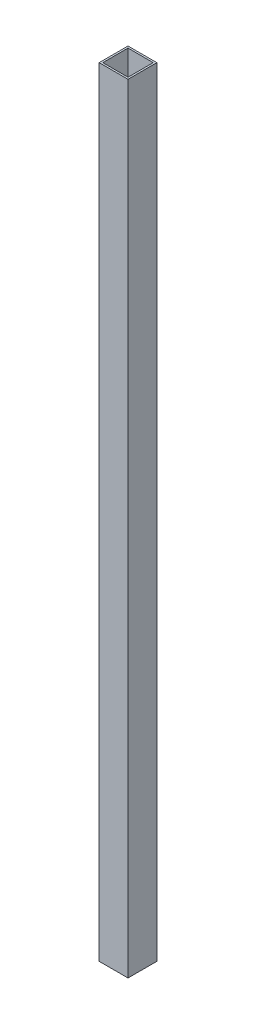
ISO-10303-21;
HEADER;
FILE_DESCRIPTION(('STEP AP214'),'2;1');
FILE_NAME('part.step','',(''),(''),'','','');
FILE_SCHEMA(('AUTOMOTIVE_DESIGN { 1 0 10303 214 1 1 1 1 }'));
ENDSEC;
DATA;
#1=APPLICATION_CONTEXT('core data for automotive mechanical design processes');
#2=APPLICATION_PROTOCOL_DEFINITION('international standard','automotive_design',2000,#1);
#3=PRODUCT_CONTEXT('',#1,'mechanical');
#4=PRODUCT('Part','Part','',(#3));
#5=PRODUCT_RELATED_PRODUCT_CATEGORY('part','',(#4));
#6=PRODUCT_DEFINITION_FORMATION('','',#4);
#7=PRODUCT_DEFINITION_CONTEXT('part definition',#1,'design');
#8=PRODUCT_DEFINITION('design','',#6,#7);
#9=PRODUCT_DEFINITION_SHAPE('','',#8);
#10=(LENGTH_UNIT() NAMED_UNIT(*) SI_UNIT(.MILLI.,.METRE.));
#11=(NAMED_UNIT(*) PLANE_ANGLE_UNIT() SI_UNIT($,.RADIAN.));
#12=(NAMED_UNIT(*) SI_UNIT($,.STERADIAN.) SOLID_ANGLE_UNIT());
#13=UNCERTAINTY_MEASURE_WITH_UNIT(LENGTH_MEASURE(1.E-05),#10,'distance_accuracy_value','');
#14=(GEOMETRIC_REPRESENTATION_CONTEXT(3) GLOBAL_UNCERTAINTY_ASSIGNED_CONTEXT((#13)) GLOBAL_UNIT_ASSIGNED_CONTEXT((#10,
#11,#12)) REPRESENTATION_CONTEXT('',''));
#15=CARTESIAN_POINT('',(0.,0.,0.));
#16=DIRECTION('',(0.,0.,1.));
#17=DIRECTION('',(1.,0.,0.));
#18=AXIS2_PLACEMENT_3D('',#15,#16,#17);
#19=CARTESIAN_POINT('',(0.,685.8,0.));
#20=DIRECTION('',(0.,-1.,0.));
#21=DIRECTION('',(0.,0.,-1.));
#22=AXIS2_PLACEMENT_3D('',#19,#20,#21);
#23=PLANE('',#22);
#24=DIRECTION('',(0.,0.,-1.));
#25=VECTOR('',#24,1.);
#26=CARTESIAN_POINT('',(12.7,685.8,12.7));
#27=LINE('',#26,#25);
#28=CARTESIAN_POINT('',(12.7,685.8,12.7));
#29=VERTEX_POINT('',#28);
#30=CARTESIAN_POINT('',(12.7,685.8,-12.7));
#31=VERTEX_POINT('',#30);
#32=EDGE_CURVE('E133',#29,#31,#27,.T.);
#33=ORIENTED_EDGE('',*,*,#32,.T.);
#34=DIRECTION('',(-1.,0.,0.));
#35=VECTOR('',#34,1.);
#36=CARTESIAN_POINT('',(-12.7,685.8,-12.7));
#37=LINE('',#36,#35);
#38=CARTESIAN_POINT('',(-12.7,685.8,-12.7));
#39=VERTEX_POINT('',#38);
#40=EDGE_CURVE('E136',#31,#39,#37,.T.);
#41=ORIENTED_EDGE('',*,*,#40,.T.);
#42=DIRECTION('',(0.,0.,1.));
#43=VECTOR('',#42,1.);
#44=CARTESIAN_POINT('',(-12.7,685.8,12.7));
#45=LINE('',#44,#43);
#46=CARTESIAN_POINT('',(-12.7,685.8,12.7));
#47=VERTEX_POINT('',#46);
#48=EDGE_CURVE('E139',#39,#47,#45,.T.);
#49=ORIENTED_EDGE('',*,*,#48,.T.);
#50=DIRECTION('',(1.,0.,0.));
#51=VECTOR('',#50,1.);
#52=CARTESIAN_POINT('',(-12.7,685.8,12.7));
#53=LINE('',#52,#51);
#54=EDGE_CURVE('E141',#47,#29,#53,.T.);
#55=ORIENTED_EDGE('',*,*,#54,.T.);
#56=EDGE_LOOP('',(#33,#41,#49,#55));
#57=FACE_BOUND('',#56,.T.);
#58=DIRECTION('',(0.,0.,-1.));
#59=VECTOR('',#58,1.);
#60=CARTESIAN_POINT('',(11.1125,685.8,11.1125));
#61=LINE('',#60,#59);
#62=CARTESIAN_POINT('',(11.1125,685.8,11.1125));
#63=VERTEX_POINT('',#62);
#64=CARTESIAN_POINT('',(11.1125,685.8,-11.1125));
#65=VERTEX_POINT('',#64);
#66=EDGE_CURVE('E97',#63,#65,#61,.T.);
#67=ORIENTED_EDGE('',*,*,#66,.F.);
#68=DIRECTION('',(1.,0.,0.));
#69=VECTOR('',#68,1.);
#70=CARTESIAN_POINT('',(-11.1125,685.8,11.1125));
#71=LINE('',#70,#69);
#72=CARTESIAN_POINT('',(-11.1125,685.8,11.1125));
#73=VERTEX_POINT('',#72);
#74=EDGE_CURVE('E119',#73,#63,#71,.T.);
#75=ORIENTED_EDGE('',*,*,#74,.F.);
#76=DIRECTION('',(0.,0.,1.));
#77=VECTOR('',#76,1.);
#78=CARTESIAN_POINT('',(-11.1125,685.8,11.1125));
#79=LINE('',#78,#77);
#80=CARTESIAN_POINT('',(-11.1125,685.8,-11.1125));
#81=VERTEX_POINT('',#80);
#82=EDGE_CURVE('E117',#81,#73,#79,.T.);
#83=ORIENTED_EDGE('',*,*,#82,.F.);
#84=DIRECTION('',(-1.,0.,0.));
#85=VECTOR('',#84,1.);
#86=CARTESIAN_POINT('',(-11.1125,685.8,-11.1125));
#87=LINE('',#86,#85);
#88=EDGE_CURVE('E105',#65,#81,#87,.T.);
#89=ORIENTED_EDGE('',*,*,#88,.F.);
#90=EDGE_LOOP('',(#67,#75,#83,#89));
#91=FACE_BOUND('',#90,.T.);
#92=ADVANCED_FACE('F32',(#57,#91),#23,.F.);
#93=CARTESIAN_POINT('',(0.,0.,0.));
#94=DIRECTION('',(0.,-1.,0.));
#95=DIRECTION('',(0.,0.,-1.));
#96=AXIS2_PLACEMENT_3D('',#93,#94,#95);
#97=PLANE('',#96);
#98=DIRECTION('',(0.,0.,-1.));
#99=VECTOR('',#98,1.);
#100=CARTESIAN_POINT('',(12.7,0.,12.7));
#101=LINE('',#100,#99);
#102=CARTESIAN_POINT('',(12.7,0.,12.7));
#103=VERTEX_POINT('',#102);
#104=CARTESIAN_POINT('',(12.7,0.,-12.7));
#105=VERTEX_POINT('',#104);
#106=EDGE_CURVE('E113',#103,#105,#101,.T.);
#107=ORIENTED_EDGE('',*,*,#106,.F.);
#108=DIRECTION('',(1.,0.,0.));
#109=VECTOR('',#108,1.);
#110=CARTESIAN_POINT('',(-12.7,0.,12.7));
#111=LINE('',#110,#109);
#112=CARTESIAN_POINT('',(-12.7,0.,12.7));
#113=VERTEX_POINT('',#112);
#114=EDGE_CURVE('E137',#113,#103,#111,.T.);
#115=ORIENTED_EDGE('',*,*,#114,.F.);
#116=DIRECTION('',(0.,0.,1.));
#117=VECTOR('',#116,1.);
#118=CARTESIAN_POINT('',(-12.7,0.,12.7));
#119=LINE('',#118,#117);
#120=CARTESIAN_POINT('',(-12.7,0.,-12.7));
#121=VERTEX_POINT('',#120);
#122=EDGE_CURVE('E148',#121,#113,#119,.T.);
#123=ORIENTED_EDGE('',*,*,#122,.F.);
#124=DIRECTION('',(-1.,0.,0.));
#125=VECTOR('',#124,1.);
#126=CARTESIAN_POINT('',(-12.7,0.,-12.7));
#127=LINE('',#126,#125);
#128=EDGE_CURVE('E146',#105,#121,#127,.T.);
#129=ORIENTED_EDGE('',*,*,#128,.F.);
#130=EDGE_LOOP('',(#107,#115,#123,#129));
#131=FACE_BOUND('',#130,.T.);
#132=DIRECTION('',(1.,0.,0.));
#133=VECTOR('',#132,1.);
#134=CARTESIAN_POINT('',(-11.1125,0.,11.1125));
#135=LINE('',#134,#133);
#136=CARTESIAN_POINT('',(-11.1125,0.,11.1125));
#137=VERTEX_POINT('',#136);
#138=CARTESIAN_POINT('',(11.1125,0.,11.1125));
#139=VERTEX_POINT('',#138);
#140=EDGE_CURVE('E106',#137,#139,#135,.T.);
#141=ORIENTED_EDGE('',*,*,#140,.T.);
#142=DIRECTION('',(0.,0.,-1.));
#143=VECTOR('',#142,1.);
#144=CARTESIAN_POINT('',(11.1125,0.,11.1125));
#145=LINE('',#144,#143);
#146=CARTESIAN_POINT('',(11.1125,0.,-11.1125));
#147=VERTEX_POINT('',#146);
#148=EDGE_CURVE('E55',#139,#147,#145,.T.);
#149=ORIENTED_EDGE('',*,*,#148,.T.);
#150=DIRECTION('',(-1.,0.,0.));
#151=VECTOR('',#150,1.);
#152=CARTESIAN_POINT('',(-11.1125,0.,-11.1125));
#153=LINE('',#152,#151);
#154=CARTESIAN_POINT('',(-11.1125,0.,-11.1125));
#155=VERTEX_POINT('',#154);
#156=EDGE_CURVE('E112',#147,#155,#153,.T.);
#157=ORIENTED_EDGE('',*,*,#156,.T.);
#158=DIRECTION('',(0.,0.,1.));
#159=VECTOR('',#158,1.);
#160=CARTESIAN_POINT('',(-11.1125,0.,11.1125));
#161=LINE('',#160,#159);
#162=EDGE_CURVE('E125',#155,#137,#161,.T.);
#163=ORIENTED_EDGE('',*,*,#162,.T.);
#164=EDGE_LOOP('',(#141,#149,#157,#163));
#165=FACE_BOUND('',#164,.T.);
#166=ADVANCED_FACE('F166',(#131,#165),#97,.T.);
#167=CARTESIAN_POINT('',(12.7,685.8,12.7));
#168=DIRECTION('',(-1.,0.,0.));
#169=DIRECTION('',(0.,0.,1.));
#170=AXIS2_PLACEMENT_3D('',#167,#168,#169);
#171=PLANE('',#170);
#172=ORIENTED_EDGE('',*,*,#106,.T.);
#173=DIRECTION('',(0.,-1.,0.));
#174=VECTOR('',#173,1.);
#175=CARTESIAN_POINT('',(12.7,685.8,-12.7));
#176=LINE('',#175,#174);
#177=EDGE_CURVE('E11',#31,#105,#176,.T.);
#178=ORIENTED_EDGE('',*,*,#177,.F.);
#179=ORIENTED_EDGE('',*,*,#32,.F.);
#180=DIRECTION('',(0.,-1.,0.));
#181=VECTOR('',#180,1.);
#182=CARTESIAN_POINT('',(12.7,685.8,12.7));
#183=LINE('',#182,#181);
#184=EDGE_CURVE('E143',#29,#103,#183,.T.);
#185=ORIENTED_EDGE('',*,*,#184,.T.);
#186=EDGE_LOOP('',(#172,#178,#179,#185));
#187=FACE_BOUND('',#186,.T.);
#188=ADVANCED_FACE('F34',(#187),#171,.F.);
#189=CARTESIAN_POINT('',(-12.7,685.8,-12.7));
#190=DIRECTION('',(0.,0.,1.));
#191=DIRECTION('',(1.,0.,0.));
#192=AXIS2_PLACEMENT_3D('',#189,#190,#191);
#193=PLANE('',#192);
#194=ORIENTED_EDGE('',*,*,#128,.T.);
#195=DIRECTION('',(0.,-1.,0.));
#196=VECTOR('',#195,1.);
#197=CARTESIAN_POINT('',(-12.7,685.8,-12.7));
#198=LINE('',#197,#196);
#199=EDGE_CURVE('E40',#39,#121,#198,.T.);
#200=ORIENTED_EDGE('',*,*,#199,.F.);
#201=ORIENTED_EDGE('',*,*,#40,.F.);
#202=ORIENTED_EDGE('',*,*,#177,.T.);
#203=EDGE_LOOP('',(#194,#200,#201,#202));
#204=FACE_BOUND('',#203,.T.);
#205=ADVANCED_FACE('F176',(#204),#193,.F.);
#206=CARTESIAN_POINT('',(-12.7,685.8,12.7));
#207=DIRECTION('',(1.,0.,0.));
#208=DIRECTION('',(0.,0.,-1.));
#209=AXIS2_PLACEMENT_3D('',#206,#207,#208);
#210=PLANE('',#209);
#211=ORIENTED_EDGE('',*,*,#122,.T.);
#212=DIRECTION('',(0.,-1.,0.));
#213=VECTOR('',#212,1.);
#214=CARTESIAN_POINT('',(-12.7,685.8,12.7));
#215=LINE('',#214,#213);
#216=EDGE_CURVE('E153',#47,#113,#215,.T.);
#217=ORIENTED_EDGE('',*,*,#216,.F.);
#218=ORIENTED_EDGE('',*,*,#48,.F.);
#219=ORIENTED_EDGE('',*,*,#199,.T.);
#220=EDGE_LOOP('',(#211,#217,#218,#219));
#221=FACE_BOUND('',#220,.T.);
#222=ADVANCED_FACE('F160',(#221),#210,.F.);
#223=CARTESIAN_POINT('',(-12.7,685.8,12.7));
#224=DIRECTION('',(0.,0.,-1.));
#225=DIRECTION('',(-1.,0.,0.));
#226=AXIS2_PLACEMENT_3D('',#223,#224,#225);
#227=PLANE('',#226);
#228=ORIENTED_EDGE('',*,*,#114,.T.);
#229=ORIENTED_EDGE('',*,*,#184,.F.);
#230=ORIENTED_EDGE('',*,*,#54,.F.);
#231=ORIENTED_EDGE('',*,*,#216,.T.);
#232=EDGE_LOOP('',(#228,#229,#230,#231));
#233=FACE_BOUND('',#232,.T.);
#234=ADVANCED_FACE('F170',(#233),#227,.F.);
#235=CARTESIAN_POINT('',(11.1125,685.8,11.1125));
#236=DIRECTION('',(-1.,0.,0.));
#237=DIRECTION('',(0.,0.,1.));
#238=AXIS2_PLACEMENT_3D('',#235,#236,#237);
#239=PLANE('',#238);
#240=ORIENTED_EDGE('',*,*,#148,.F.);
#241=DIRECTION('',(0.,-1.,0.));
#242=VECTOR('',#241,1.);
#243=CARTESIAN_POINT('',(11.1125,685.8,11.1125));
#244=LINE('',#243,#242);
#245=EDGE_CURVE('E101',#63,#139,#244,.T.);
#246=ORIENTED_EDGE('',*,*,#245,.F.);
#247=ORIENTED_EDGE('',*,*,#66,.T.);
#248=DIRECTION('',(0.,-1.,0.));
#249=VECTOR('',#248,1.);
#250=CARTESIAN_POINT('',(11.1125,685.8,-11.1125));
#251=LINE('',#250,#249);
#252=EDGE_CURVE('E100',#65,#147,#251,.T.);
#253=ORIENTED_EDGE('',*,*,#252,.T.);
#254=EDGE_LOOP('',(#240,#246,#247,#253));
#255=FACE_BOUND('',#254,.T.);
#256=ADVANCED_FACE('F99',(#255),#239,.T.);
#257=CARTESIAN_POINT('',(-11.1125,685.8,-11.1125));
#258=DIRECTION('',(0.,0.,1.));
#259=DIRECTION('',(1.,0.,0.));
#260=AXIS2_PLACEMENT_3D('',#257,#258,#259);
#261=PLANE('',#260);
#262=ORIENTED_EDGE('',*,*,#156,.F.);
#263=ORIENTED_EDGE('',*,*,#252,.F.);
#264=ORIENTED_EDGE('',*,*,#88,.T.);
#265=DIRECTION('',(0.,-1.,0.));
#266=VECTOR('',#265,1.);
#267=CARTESIAN_POINT('',(-11.1125,685.8,-11.1125));
#268=LINE('',#267,#266);
#269=EDGE_CURVE('E114',#81,#155,#268,.T.);
#270=ORIENTED_EDGE('',*,*,#269,.T.);
#271=EDGE_LOOP('',(#262,#263,#264,#270));
#272=FACE_BOUND('',#271,.T.);
#273=ADVANCED_FACE('F109',(#272),#261,.T.);
#274=CARTESIAN_POINT('',(-11.1125,685.8,11.1125));
#275=DIRECTION('',(1.,0.,0.));
#276=DIRECTION('',(0.,0.,-1.));
#277=AXIS2_PLACEMENT_3D('',#274,#275,#276);
#278=PLANE('',#277);
#279=ORIENTED_EDGE('',*,*,#162,.F.);
#280=ORIENTED_EDGE('',*,*,#269,.F.);
#281=ORIENTED_EDGE('',*,*,#82,.T.);
#282=DIRECTION('',(0.,-1.,0.));
#283=VECTOR('',#282,1.);
#284=CARTESIAN_POINT('',(-11.1125,685.8,11.1125));
#285=LINE('',#284,#283);
#286=EDGE_CURVE('E47',#73,#137,#285,.T.);
#287=ORIENTED_EDGE('',*,*,#286,.T.);
#288=EDGE_LOOP('',(#279,#280,#281,#287));
#289=FACE_BOUND('',#288,.T.);
#290=ADVANCED_FACE('F199',(#289),#278,.T.);
#291=CARTESIAN_POINT('',(-11.1125,685.8,11.1125));
#292=DIRECTION('',(0.,0.,-1.));
#293=DIRECTION('',(-1.,0.,0.));
#294=AXIS2_PLACEMENT_3D('',#291,#292,#293);
#295=PLANE('',#294);
#296=ORIENTED_EDGE('',*,*,#140,.F.);
#297=ORIENTED_EDGE('',*,*,#286,.F.);
#298=ORIENTED_EDGE('',*,*,#74,.T.);
#299=ORIENTED_EDGE('',*,*,#245,.T.);
#300=EDGE_LOOP('',(#296,#297,#298,#299));
#301=FACE_BOUND('',#300,.T.);
#302=ADVANCED_FACE('F203',(#301),#295,.T.);
#303=CLOSED_SHELL('',(#92,#166,#188,#205,#222,#234,#256,#273,#290,#302));
#304=MANIFOLD_SOLID_BREP('B2',#303);
#305=ADVANCED_BREP_SHAPE_REPRESENTATION('',(#18,#304),#14);
#306=SHAPE_DEFINITION_REPRESENTATION(#9,#305);
ENDSEC;
END-ISO-10303-21;
